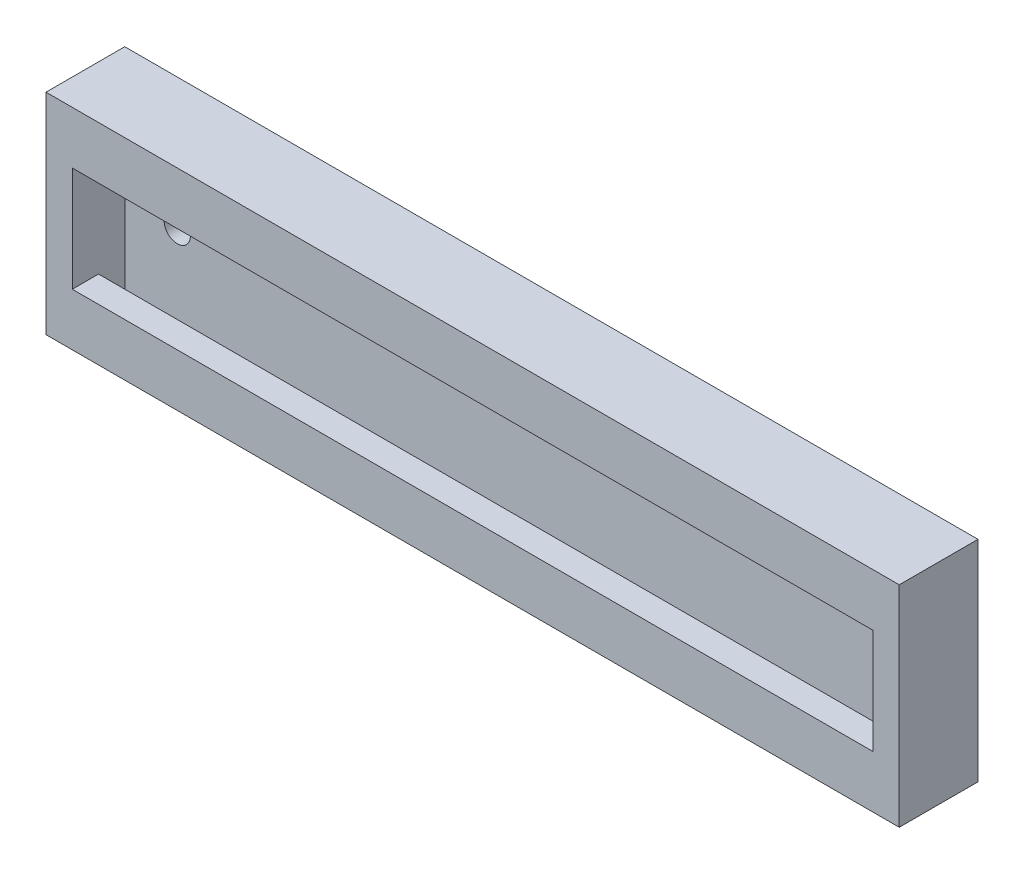
ISO-10303-21;
HEADER;
FILE_DESCRIPTION(('STEP AP214'),'2;1');
FILE_NAME('part.step','',(''),(''),'','','');
FILE_SCHEMA(('AUTOMOTIVE_DESIGN { 1 0 10303 214 1 1 1 1 }'));
ENDSEC;
DATA;
#1=APPLICATION_CONTEXT('core data for automotive mechanical design processes');
#2=APPLICATION_PROTOCOL_DEFINITION('international standard','automotive_design',2000,#1);
#3=PRODUCT_CONTEXT('',#1,'mechanical');
#4=PRODUCT('Part','Part','',(#3));
#5=PRODUCT_RELATED_PRODUCT_CATEGORY('part','',(#4));
#6=PRODUCT_DEFINITION_FORMATION('','',#4);
#7=PRODUCT_DEFINITION_CONTEXT('part definition',#1,'design');
#8=PRODUCT_DEFINITION('design','',#6,#7);
#9=PRODUCT_DEFINITION_SHAPE('','',#8);
#10=(LENGTH_UNIT() NAMED_UNIT(*) SI_UNIT(.MILLI.,.METRE.));
#11=(NAMED_UNIT(*) PLANE_ANGLE_UNIT() SI_UNIT($,.RADIAN.));
#12=(NAMED_UNIT(*) SI_UNIT($,.STERADIAN.) SOLID_ANGLE_UNIT());
#13=UNCERTAINTY_MEASURE_WITH_UNIT(LENGTH_MEASURE(1.E-05),#10,'distance_accuracy_value','');
#14=(GEOMETRIC_REPRESENTATION_CONTEXT(3) GLOBAL_UNCERTAINTY_ASSIGNED_CONTEXT((#13)) GLOBAL_UNIT_ASSIGNED_CONTEXT((#10,
#11,#12)) REPRESENTATION_CONTEXT('',''));
#15=CARTESIAN_POINT('',(0.,0.,0.));
#16=DIRECTION('',(0.,0.,1.));
#17=DIRECTION('',(1.,0.,0.));
#18=AXIS2_PLACEMENT_3D('',#15,#16,#17);
#19=CARTESIAN_POINT('',(32.5,-8.,2.));
#20=DIRECTION('',(-1.,0.,0.));
#21=DIRECTION('',(0.,0.,1.));
#22=AXIS2_PLACEMENT_3D('',#19,#20,#21);
#23=PLANE('',#22);
#24=DIRECTION('',(0.,1.,0.));
#25=VECTOR('',#24,1.);
#26=CARTESIAN_POINT('',(32.5,-8.,0.));
#27=LINE('',#26,#25);
#28=CARTESIAN_POINT('',(32.5,-8.,0.));
#29=VERTEX_POINT('',#28);
#30=CARTESIAN_POINT('',(32.5,8.,0.));
#31=VERTEX_POINT('',#30);
#32=EDGE_CURVE('E215',#29,#31,#27,.T.);
#33=ORIENTED_EDGE('',*,*,#32,.T.);
#34=DIRECTION('',(0.,0.,-1.));
#35=VECTOR('',#34,1.);
#36=CARTESIAN_POINT('',(32.5,8.,2.));
#37=LINE('',#36,#35);
#38=CARTESIAN_POINT('',(32.5,8.,6.));
#39=VERTEX_POINT('',#38);
#40=EDGE_CURVE('E11',#39,#31,#37,.T.);
#41=ORIENTED_EDGE('',*,*,#40,.F.);
#42=DIRECTION('',(0.,1.,0.));
#43=VECTOR('',#42,1.);
#44=CARTESIAN_POINT('',(32.5,8.,6.));
#45=LINE('',#44,#43);
#46=CARTESIAN_POINT('',(32.5,-8.,6.));
#47=VERTEX_POINT('',#46);
#48=EDGE_CURVE('E150',#47,#39,#45,.T.);
#49=ORIENTED_EDGE('',*,*,#48,.F.);
#50=DIRECTION('',(0.,0.,-1.));
#51=VECTOR('',#50,1.);
#52=CARTESIAN_POINT('',(32.5,-8.,2.));
#53=LINE('',#52,#51);
#54=EDGE_CURVE('E223',#47,#29,#53,.T.);
#55=ORIENTED_EDGE('',*,*,#54,.T.);
#56=EDGE_LOOP('',(#33,#41,#49,#55));
#57=FACE_BOUND('',#56,.T.);
#58=ADVANCED_FACE('F39',(#57),#23,.F.);
#59=CARTESIAN_POINT('',(-32.5,8.,2.));
#60=DIRECTION('',(0.,-1.,0.));
#61=DIRECTION('',(0.,0.,-1.));
#62=AXIS2_PLACEMENT_3D('',#59,#60,#61);
#63=PLANE('',#62);
#64=DIRECTION('',(-1.,0.,0.));
#65=VECTOR('',#64,1.);
#66=CARTESIAN_POINT('',(-32.5,8.,0.));
#67=LINE('',#66,#65);
#68=CARTESIAN_POINT('',(-32.5,8.,0.));
#69=VERTEX_POINT('',#68);
#70=EDGE_CURVE('E218',#31,#69,#67,.T.);
#71=ORIENTED_EDGE('',*,*,#70,.T.);
#72=DIRECTION('',(0.,0.,-1.));
#73=VECTOR('',#72,1.);
#74=CARTESIAN_POINT('',(-32.5,8.,2.));
#75=LINE('',#74,#73);
#76=CARTESIAN_POINT('',(-32.5,8.,6.));
#77=VERTEX_POINT('',#76);
#78=EDGE_CURVE('E46',#77,#69,#75,.T.);
#79=ORIENTED_EDGE('',*,*,#78,.F.);
#80=DIRECTION('',(-1.,0.,0.));
#81=VECTOR('',#80,1.);
#82=CARTESIAN_POINT('',(-32.5,8.,6.));
#83=LINE('',#82,#81);
#84=EDGE_CURVE('E174',#39,#77,#83,.T.);
#85=ORIENTED_EDGE('',*,*,#84,.F.);
#86=ORIENTED_EDGE('',*,*,#40,.T.);
#87=EDGE_LOOP('',(#71,#79,#85,#86));
#88=FACE_BOUND('',#87,.T.);
#89=ADVANCED_FACE('F241',(#88),#63,.F.);
#90=CARTESIAN_POINT('',(-32.5,-8.,2.));
#91=DIRECTION('',(1.,0.,0.));
#92=DIRECTION('',(0.,0.,-1.));
#93=AXIS2_PLACEMENT_3D('',#90,#91,#92);
#94=PLANE('',#93);
#95=DIRECTION('',(0.,-1.,0.));
#96=VECTOR('',#95,1.);
#97=CARTESIAN_POINT('',(-32.5,-8.,0.));
#98=LINE('',#97,#96);
#99=CARTESIAN_POINT('',(-32.5,-8.,0.));
#100=VERTEX_POINT('',#99);
#101=EDGE_CURVE('E220',#69,#100,#98,.T.);
#102=ORIENTED_EDGE('',*,*,#101,.T.);
#103=DIRECTION('',(0.,0.,-1.));
#104=VECTOR('',#103,1.);
#105=CARTESIAN_POINT('',(-32.5,-8.,2.));
#106=LINE('',#105,#104);
#107=CARTESIAN_POINT('',(-32.5,-8.,6.));
#108=VERTEX_POINT('',#107);
#109=EDGE_CURVE('E225',#108,#100,#106,.T.);
#110=ORIENTED_EDGE('',*,*,#109,.F.);
#111=DIRECTION('',(0.,-1.,0.));
#112=VECTOR('',#111,1.);
#113=CARTESIAN_POINT('',(-32.5,8.,6.));
#114=LINE('',#113,#112);
#115=EDGE_CURVE('E177',#77,#108,#114,.T.);
#116=ORIENTED_EDGE('',*,*,#115,.F.);
#117=ORIENTED_EDGE('',*,*,#78,.T.);
#118=EDGE_LOOP('',(#102,#110,#116,#117));
#119=FACE_BOUND('',#118,.T.);
#120=ADVANCED_FACE('F230',(#119),#94,.F.);
#121=CARTESIAN_POINT('',(-32.5,-8.,2.));
#122=DIRECTION('',(0.,1.,0.));
#123=DIRECTION('',(0.,0.,1.));
#124=AXIS2_PLACEMENT_3D('',#121,#122,#123);
#125=PLANE('',#124);
#126=DIRECTION('',(1.,0.,0.));
#127=VECTOR('',#126,1.);
#128=CARTESIAN_POINT('',(-32.5,-8.,0.));
#129=LINE('',#128,#127);
#130=EDGE_CURVE('E61',#100,#29,#129,.T.);
#131=ORIENTED_EDGE('',*,*,#130,.T.);
#132=ORIENTED_EDGE('',*,*,#54,.F.);
#133=DIRECTION('',(1.,0.,0.));
#134=VECTOR('',#133,1.);
#135=CARTESIAN_POINT('',(-32.5,-8.,6.));
#136=LINE('',#135,#134);
#137=EDGE_CURVE('E180',#108,#47,#136,.T.);
#138=ORIENTED_EDGE('',*,*,#137,.F.);
#139=ORIENTED_EDGE('',*,*,#109,.T.);
#140=EDGE_LOOP('',(#131,#132,#138,#139));
#141=FACE_BOUND('',#140,.T.);
#142=ADVANCED_FACE('F239',(#141),#125,.F.);
#143=CARTESIAN_POINT('',(0.,0.,0.));
#144=DIRECTION('',(0.,0.,-1.));
#145=DIRECTION('',(-1.,0.,0.));
#146=AXIS2_PLACEMENT_3D('',#143,#144,#145);
#147=PLANE('',#146);
#148=ORIENTED_EDGE('',*,*,#32,.F.);
#149=ORIENTED_EDGE('',*,*,#130,.F.);
#150=ORIENTED_EDGE('',*,*,#101,.F.);
#151=ORIENTED_EDGE('',*,*,#70,.F.);
#152=EDGE_LOOP('',(#148,#149,#150,#151));
#153=FACE_BOUND('',#152,.T.);
#154=ADVANCED_FACE('F235',(#153),#147,.T.);
#155=CARTESIAN_POINT('',(0.,0.,4.));
#156=DIRECTION('',(0.,0.,1.));
#157=DIRECTION('',(1.,0.,0.));
#158=AXIS2_PLACEMENT_3D('',#155,#156,#157);
#159=PLANE('',#158);
#160=DIRECTION('',(0.,1.,0.));
#161=VECTOR('',#160,1.);
#162=CARTESIAN_POINT('',(30.5,6.,4.));
#163=LINE('',#162,#161);
#164=CARTESIAN_POINT('',(30.5,4.,4.));
#165=VERTEX_POINT('',#164);
#166=CARTESIAN_POINT('',(30.5,6.,4.));
#167=VERTEX_POINT('',#166);
#168=EDGE_CURVE('E187',#165,#167,#163,.T.);
#169=ORIENTED_EDGE('',*,*,#168,.F.);
#170=DIRECTION('',(-1.,0.,0.));
#171=VECTOR('',#170,1.);
#172=CARTESIAN_POINT('',(-30.5,4.,4.));
#173=LINE('',#172,#171);
#174=CARTESIAN_POINT('',(-30.5,4.,4.));
#175=VERTEX_POINT('',#174);
#176=EDGE_CURVE('E149',#165,#175,#173,.T.);
#177=ORIENTED_EDGE('',*,*,#176,.T.);
#178=DIRECTION('',(0.,-1.,0.));
#179=VECTOR('',#178,1.);
#180=CARTESIAN_POINT('',(-30.5,6.,4.));
#181=LINE('',#180,#179);
#182=CARTESIAN_POINT('',(-30.5,6.,4.));
#183=VERTEX_POINT('',#182);
#184=EDGE_CURVE('E191',#183,#175,#181,.T.);
#185=ORIENTED_EDGE('',*,*,#184,.F.);
#186=DIRECTION('',(-1.,0.,0.));
#187=VECTOR('',#186,1.);
#188=CARTESIAN_POINT('',(-30.5,6.,4.));
#189=LINE('',#188,#187);
#190=EDGE_CURVE('E186',#167,#183,#189,.T.);
#191=ORIENTED_EDGE('',*,*,#190,.F.);
#192=EDGE_LOOP('',(#169,#177,#185,#191));
#193=FACE_BOUND('',#192,.T.);
#194=ADVANCED_FACE('F253',(#193),#159,.F.);
#195=CARTESIAN_POINT('',(0.,0.,6.));
#196=DIRECTION('',(0.,0.,1.));
#197=DIRECTION('',(1.,0.,0.));
#198=AXIS2_PLACEMENT_3D('',#195,#196,#197);
#199=PLANE('',#198);
#200=ORIENTED_EDGE('',*,*,#48,.T.);
#201=ORIENTED_EDGE('',*,*,#84,.T.);
#202=ORIENTED_EDGE('',*,*,#115,.T.);
#203=ORIENTED_EDGE('',*,*,#137,.T.);
#204=EDGE_LOOP('',(#200,#201,#202,#203));
#205=FACE_BOUND('',#204,.T.);
#206=DIRECTION('',(-1.,0.,0.));
#207=VECTOR('',#206,1.);
#208=CARTESIAN_POINT('',(-30.5,4.,6.));
#209=LINE('',#208,#207);
#210=CARTESIAN_POINT('',(30.5,4.,6.));
#211=VERTEX_POINT('',#210);
#212=CARTESIAN_POINT('',(-30.5,4.,6.));
#213=VERTEX_POINT('',#212);
#214=EDGE_CURVE('E141',#211,#213,#209,.T.);
#215=ORIENTED_EDGE('',*,*,#214,.F.);
#216=DIRECTION('',(0.,1.,0.));
#217=VECTOR('',#216,1.);
#218=CARTESIAN_POINT('',(30.5,4.,6.));
#219=LINE('',#218,#217);
#220=CARTESIAN_POINT('',(30.5,-4.,6.));
#221=VERTEX_POINT('',#220);
#222=EDGE_CURVE('E131',#221,#211,#219,.T.);
#223=ORIENTED_EDGE('',*,*,#222,.F.);
#224=DIRECTION('',(1.,0.,0.));
#225=VECTOR('',#224,1.);
#226=CARTESIAN_POINT('',(-30.5,-4.,6.));
#227=LINE('',#226,#225);
#228=CARTESIAN_POINT('',(-30.5,-4.,6.));
#229=VERTEX_POINT('',#228);
#230=EDGE_CURVE('E158',#229,#221,#227,.T.);
#231=ORIENTED_EDGE('',*,*,#230,.F.);
#232=DIRECTION('',(0.,-1.,0.));
#233=VECTOR('',#232,1.);
#234=CARTESIAN_POINT('',(-30.5,4.,6.));
#235=LINE('',#234,#233);
#236=EDGE_CURVE('E156',#213,#229,#235,.T.);
#237=ORIENTED_EDGE('',*,*,#236,.F.);
#238=EDGE_LOOP('',(#215,#223,#231,#237));
#239=FACE_BOUND('',#238,.T.);
#240=ADVANCED_FACE('F154',(#205,#239),#199,.T.);
#241=CARTESIAN_POINT('',(30.5,-6.,4.));
#242=VERTEX_POINT('',#241);
#243=CARTESIAN_POINT('',(30.5,-4.,4.));
#244=VERTEX_POINT('',#243);
#245=EDGE_CURVE('E184',#242,#244,#163,.T.);
#246=ORIENTED_EDGE('',*,*,#245,.F.);
#247=DIRECTION('',(1.,0.,0.));
#248=VECTOR('',#247,1.);
#249=CARTESIAN_POINT('',(-30.5,-6.,4.));
#250=LINE('',#249,#248);
#251=CARTESIAN_POINT('',(-30.5,-6.,4.));
#252=VERTEX_POINT('',#251);
#253=EDGE_CURVE('E194',#252,#242,#250,.T.);
#254=ORIENTED_EDGE('',*,*,#253,.F.);
#255=CARTESIAN_POINT('',(-30.5,-4.,4.));
#256=VERTEX_POINT('',#255);
#257=EDGE_CURVE('E190',#256,#252,#181,.T.);
#258=ORIENTED_EDGE('',*,*,#257,.F.);
#259=DIRECTION('',(1.,0.,0.));
#260=VECTOR('',#259,1.);
#261=CARTESIAN_POINT('',(-30.5,-4.,4.));
#262=LINE('',#261,#260);
#263=EDGE_CURVE('E142',#256,#244,#262,.T.);
#264=ORIENTED_EDGE('',*,*,#263,.T.);
#265=EDGE_LOOP('',(#246,#254,#258,#264));
#266=FACE_BOUND('',#265,.T.);
#267=ADVANCED_FACE('F273',(#266),#159,.F.);
#268=CARTESIAN_POINT('',(-30.5,4.,6.));
#269=DIRECTION('',(0.,-1.,0.));
#270=DIRECTION('',(0.,0.,-1.));
#271=AXIS2_PLACEMENT_3D('',#268,#269,#270);
#272=PLANE('',#271);
#273=ORIENTED_EDGE('',*,*,#176,.F.);
#274=DIRECTION('',(0.,0.,-1.));
#275=VECTOR('',#274,1.);
#276=CARTESIAN_POINT('',(30.5,4.,6.));
#277=LINE('',#276,#275);
#278=EDGE_CURVE('E135',#211,#165,#277,.T.);
#279=ORIENTED_EDGE('',*,*,#278,.F.);
#280=ORIENTED_EDGE('',*,*,#214,.T.);
#281=DIRECTION('',(0.,0.,-1.));
#282=VECTOR('',#281,1.);
#283=CARTESIAN_POINT('',(-30.5,4.,6.));
#284=LINE('',#283,#282);
#285=EDGE_CURVE('E151',#213,#175,#284,.T.);
#286=ORIENTED_EDGE('',*,*,#285,.T.);
#287=EDGE_LOOP('',(#273,#279,#280,#286));
#288=FACE_BOUND('',#287,.T.);
#289=ADVANCED_FACE('F146',(#288),#272,.T.);
#290=CARTESIAN_POINT('',(-30.5,-4.,6.));
#291=DIRECTION('',(0.,1.,0.));
#292=DIRECTION('',(0.,0.,1.));
#293=AXIS2_PLACEMENT_3D('',#290,#291,#292);
#294=PLANE('',#293);
#295=ORIENTED_EDGE('',*,*,#263,.F.);
#296=DIRECTION('',(0.,0.,-1.));
#297=VECTOR('',#296,1.);
#298=CARTESIAN_POINT('',(-30.5,-4.,6.));
#299=LINE('',#298,#297);
#300=EDGE_CURVE('E168',#229,#256,#299,.T.);
#301=ORIENTED_EDGE('',*,*,#300,.F.);
#302=ORIENTED_EDGE('',*,*,#230,.T.);
#303=DIRECTION('',(0.,0.,-1.));
#304=VECTOR('',#303,1.);
#305=CARTESIAN_POINT('',(30.5,-4.,6.));
#306=LINE('',#305,#304);
#307=EDGE_CURVE('E137',#221,#244,#306,.T.);
#308=ORIENTED_EDGE('',*,*,#307,.T.);
#309=EDGE_LOOP('',(#295,#301,#302,#308));
#310=FACE_BOUND('',#309,.T.);
#311=ADVANCED_FACE('F258',(#310),#294,.T.);
#312=CARTESIAN_POINT('',(0.,0.,2.));
#313=DIRECTION('',(0.,0.,-1.));
#314=DIRECTION('',(-1.,0.,0.));
#315=AXIS2_PLACEMENT_3D('',#312,#313,#314);
#316=PLANE('',#315);
#317=CARTESIAN_POINT('',(-26.5,0.,2.));
#318=DIRECTION('',(0.,0.,1.));
#319=DIRECTION('',(1.,0.,0.));
#320=AXIS2_PLACEMENT_3D('',#317,#318,#319);
#321=CIRCLE('',#320,1.);
#322=CARTESIAN_POINT('',(-25.5,0.,2.));
#323=VERTEX_POINT('',#322);
#324=EDGE_CURVE('E294',#323,#323,#321,.T.);
#325=ORIENTED_EDGE('',*,*,#324,.F.);
#326=EDGE_LOOP('',(#325));
#327=FACE_BOUND('',#326,.T.);
#328=DIRECTION('',(1.,0.,0.));
#329=VECTOR('',#328,1.);
#330=CARTESIAN_POINT('',(-30.5,-6.,2.));
#331=LINE('',#330,#329);
#332=CARTESIAN_POINT('',(-30.5,-6.,2.));
#333=VERTEX_POINT('',#332);
#334=CARTESIAN_POINT('',(30.5,-6.,2.));
#335=VERTEX_POINT('',#334);
#336=EDGE_CURVE('E204',#333,#335,#331,.T.);
#337=ORIENTED_EDGE('',*,*,#336,.T.);
#338=DIRECTION('',(0.,1.,0.));
#339=VECTOR('',#338,1.);
#340=CARTESIAN_POINT('',(30.5,6.,2.));
#341=LINE('',#340,#339);
#342=CARTESIAN_POINT('',(30.5,6.,2.));
#343=VERTEX_POINT('',#342);
#344=EDGE_CURVE('E183',#335,#343,#341,.T.);
#345=ORIENTED_EDGE('',*,*,#344,.T.);
#346=DIRECTION('',(-1.,0.,0.));
#347=VECTOR('',#346,1.);
#348=CARTESIAN_POINT('',(-30.5,6.,2.));
#349=LINE('',#348,#347);
#350=CARTESIAN_POINT('',(-30.5,6.,2.));
#351=VERTEX_POINT('',#350);
#352=EDGE_CURVE('E198',#343,#351,#349,.T.);
#353=ORIENTED_EDGE('',*,*,#352,.T.);
#354=DIRECTION('',(0.,-1.,0.));
#355=VECTOR('',#354,1.);
#356=CARTESIAN_POINT('',(-30.5,6.,2.));
#357=LINE('',#356,#355);
#358=EDGE_CURVE('E201',#351,#333,#357,.T.);
#359=ORIENTED_EDGE('',*,*,#358,.T.);
#360=EDGE_LOOP('',(#337,#345,#353,#359));
#361=FACE_BOUND('',#360,.T.);
#362=ADVANCED_FACE('F254',(#327,#361),#316,.F.);
#363=CARTESIAN_POINT('',(-30.5,6.,4.));
#364=DIRECTION('',(1.,0.,0.));
#365=DIRECTION('',(0.,0.,-1.));
#366=AXIS2_PLACEMENT_3D('',#363,#364,#365);
#367=PLANE('',#366);
#368=ORIENTED_EDGE('',*,*,#358,.F.);
#369=DIRECTION('',(0.,0.,-1.));
#370=VECTOR('',#369,1.);
#371=CARTESIAN_POINT('',(-30.5,6.,4.));
#372=LINE('',#371,#370);
#373=EDGE_CURVE('E210',#183,#351,#372,.T.);
#374=ORIENTED_EDGE('',*,*,#373,.F.);
#375=ORIENTED_EDGE('',*,*,#184,.T.);
#376=ORIENTED_EDGE('',*,*,#285,.F.);
#377=ORIENTED_EDGE('',*,*,#236,.T.);
#378=ORIENTED_EDGE('',*,*,#300,.T.);
#379=ORIENTED_EDGE('',*,*,#257,.T.);
#380=DIRECTION('',(0.,0.,-1.));
#381=VECTOR('',#380,1.);
#382=CARTESIAN_POINT('',(-30.5,-6.,4.));
#383=LINE('',#382,#381);
#384=EDGE_CURVE('E208',#252,#333,#383,.T.);
#385=ORIENTED_EDGE('',*,*,#384,.T.);
#386=EDGE_LOOP('',(#368,#374,#375,#376,#377,#378,#379,#385));
#387=FACE_BOUND('',#386,.T.);
#388=ADVANCED_FACE('F257',(#387),#367,.T.);
#389=CARTESIAN_POINT('',(-30.5,-6.,4.));
#390=DIRECTION('',(0.,1.,0.));
#391=DIRECTION('',(0.,0.,1.));
#392=AXIS2_PLACEMENT_3D('',#389,#390,#391);
#393=PLANE('',#392);
#394=ORIENTED_EDGE('',*,*,#336,.F.);
#395=ORIENTED_EDGE('',*,*,#384,.F.);
#396=ORIENTED_EDGE('',*,*,#253,.T.);
#397=DIRECTION('',(0.,0.,-1.));
#398=VECTOR('',#397,1.);
#399=CARTESIAN_POINT('',(30.5,-6.,4.));
#400=LINE('',#399,#398);
#401=EDGE_CURVE('E53',#242,#335,#400,.T.);
#402=ORIENTED_EDGE('',*,*,#401,.T.);
#403=EDGE_LOOP('',(#394,#395,#396,#402));
#404=FACE_BOUND('',#403,.T.);
#405=ADVANCED_FACE('F263',(#404),#393,.T.);
#406=CARTESIAN_POINT('',(30.5,6.,4.));
#407=DIRECTION('',(-1.,0.,0.));
#408=DIRECTION('',(0.,0.,1.));
#409=AXIS2_PLACEMENT_3D('',#406,#407,#408);
#410=PLANE('',#409);
#411=ORIENTED_EDGE('',*,*,#344,.F.);
#412=ORIENTED_EDGE('',*,*,#401,.F.);
#413=ORIENTED_EDGE('',*,*,#245,.T.);
#414=ORIENTED_EDGE('',*,*,#307,.F.);
#415=ORIENTED_EDGE('',*,*,#222,.T.);
#416=ORIENTED_EDGE('',*,*,#278,.T.);
#417=ORIENTED_EDGE('',*,*,#168,.T.);
#418=DIRECTION('',(0.,0.,-1.));
#419=VECTOR('',#418,1.);
#420=CARTESIAN_POINT('',(30.5,6.,4.));
#421=LINE('',#420,#419);
#422=EDGE_CURVE('E212',#167,#343,#421,.T.);
#423=ORIENTED_EDGE('',*,*,#422,.T.);
#424=EDGE_LOOP('',(#411,#412,#413,#414,#415,#416,#417,#423));
#425=FACE_BOUND('',#424,.T.);
#426=ADVANCED_FACE('F133',(#425),#410,.T.);
#427=CARTESIAN_POINT('',(-30.5,6.,4.));
#428=DIRECTION('',(0.,-1.,0.));
#429=DIRECTION('',(0.,0.,-1.));
#430=AXIS2_PLACEMENT_3D('',#427,#428,#429);
#431=PLANE('',#430);
#432=ORIENTED_EDGE('',*,*,#352,.F.);
#433=ORIENTED_EDGE('',*,*,#422,.F.);
#434=ORIENTED_EDGE('',*,*,#190,.T.);
#435=ORIENTED_EDGE('',*,*,#373,.T.);
#436=EDGE_LOOP('',(#432,#433,#434,#435));
#437=FACE_BOUND('',#436,.T.);
#438=ADVANCED_FACE('F262',(#437),#431,.T.);
#439=CARTESIAN_POINT('',(-26.5,0.,1.));
#440=DIRECTION('',(0.,0.,1.));
#441=DIRECTION('',(1.,0.,0.));
#442=AXIS2_PLACEMENT_3D('',#439,#440,#441);
#443=CYLINDRICAL_SURFACE('',#442,1.);
#444=CARTESIAN_POINT('',(-26.5,0.,1.));
#445=DIRECTION('',(0.,0.,1.));
#446=DIRECTION('',(1.,0.,0.));
#447=AXIS2_PLACEMENT_3D('',#444,#445,#446);
#448=CIRCLE('',#447,1.);
#449=CARTESIAN_POINT('',(-25.5,0.,1.));
#450=VERTEX_POINT('',#449);
#451=EDGE_CURVE('E164',#450,#450,#448,.T.);
#452=ORIENTED_EDGE('',*,*,#451,.F.);
#453=EDGE_LOOP('',(#452));
#454=FACE_BOUND('',#453,.T.);
#455=ORIENTED_EDGE('',*,*,#324,.T.);
#456=EDGE_LOOP('',(#455));
#457=FACE_BOUND('',#456,.T.);
#458=ADVANCED_FACE('F266',(#454,#457),#443,.F.);
#459=CARTESIAN_POINT('',(-26.5,0.,1.));
#460=DIRECTION('',(0.,0.,1.));
#461=DIRECTION('',(1.,0.,0.));
#462=AXIS2_PLACEMENT_3D('',#459,#460,#461);
#463=PLANE('',#462);
#464=ORIENTED_EDGE('',*,*,#451,.T.);
#465=EDGE_LOOP('',(#464));
#466=FACE_BOUND('',#465,.T.);
#467=ADVANCED_FACE('F286',(#466),#463,.T.);
#468=CLOSED_SHELL('',(#58,#89,#120,#142,#154,#194,#240,#267,#289,#311,#362,#388,#405,#426,#438,
#458,#467));
#469=MANIFOLD_SOLID_BREP('B2',#468);
#470=ADVANCED_BREP_SHAPE_REPRESENTATION('',(#18,#469),#14);
#471=SHAPE_DEFINITION_REPRESENTATION(#9,#470);
ENDSEC;
END-ISO-10303-21;
